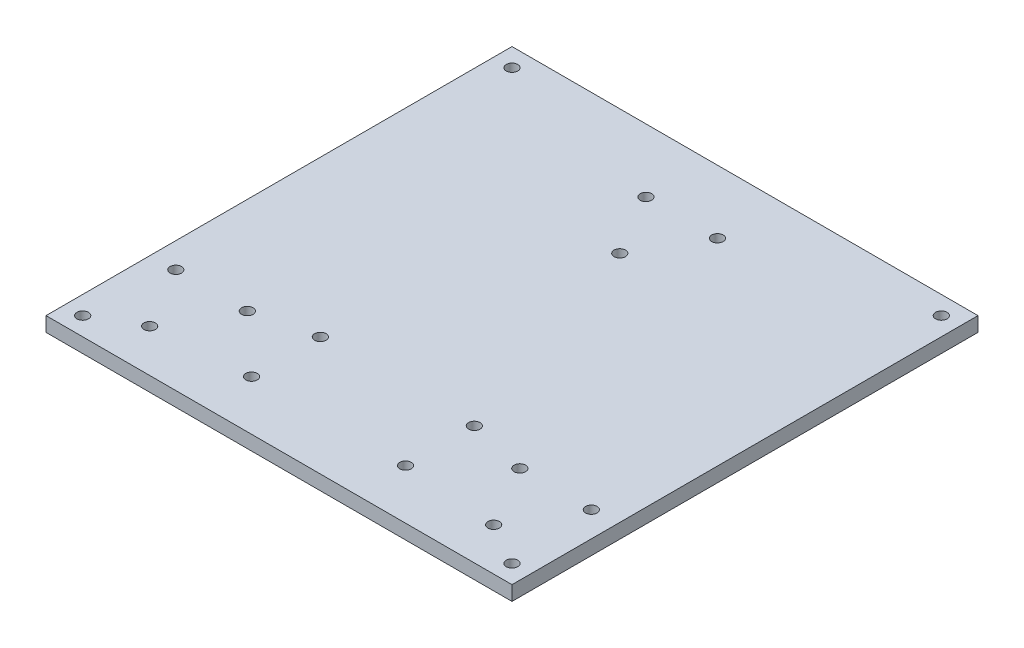
ISO-10303-21;
HEADER;
FILE_DESCRIPTION(('STEP AP214'),'2;1');
FILE_NAME('part.step','',(''),(''),'','','');
FILE_SCHEMA(('AUTOMOTIVE_DESIGN { 1 0 10303 214 1 1 1 1 }'));
ENDSEC;
DATA;
#1=APPLICATION_CONTEXT('core data for automotive mechanical design processes');
#2=APPLICATION_PROTOCOL_DEFINITION('international standard','automotive_design',2000,#1);
#3=PRODUCT_CONTEXT('',#1,'mechanical');
#4=PRODUCT('Part','Part','',(#3));
#5=PRODUCT_RELATED_PRODUCT_CATEGORY('part','',(#4));
#6=PRODUCT_DEFINITION_FORMATION('','',#4);
#7=PRODUCT_DEFINITION_CONTEXT('part definition',#1,'design');
#8=PRODUCT_DEFINITION('design','',#6,#7);
#9=PRODUCT_DEFINITION_SHAPE('','',#8);
#10=(LENGTH_UNIT() NAMED_UNIT(*) SI_UNIT(.MILLI.,.METRE.));
#11=(NAMED_UNIT(*) PLANE_ANGLE_UNIT() SI_UNIT($,.RADIAN.));
#12=(NAMED_UNIT(*) SI_UNIT($,.STERADIAN.) SOLID_ANGLE_UNIT());
#13=UNCERTAINTY_MEASURE_WITH_UNIT(LENGTH_MEASURE(1.E-05),#10,'distance_accuracy_value','');
#14=(GEOMETRIC_REPRESENTATION_CONTEXT(3) GLOBAL_UNCERTAINTY_ASSIGNED_CONTEXT((#13)) GLOBAL_UNIT_ASSIGNED_CONTEXT((#10,
#11,#12)) REPRESENTATION_CONTEXT('',''));
#15=CARTESIAN_POINT('',(0.,0.,0.));
#16=DIRECTION('',(0.,0.,1.));
#17=DIRECTION('',(1.,0.,0.));
#18=AXIS2_PLACEMENT_3D('',#15,#16,#17);
#19=CARTESIAN_POINT('',(101.6,6.35,101.6));
#20=DIRECTION('',(-1.,0.,0.));
#21=DIRECTION('',(0.,0.,1.));
#22=AXIS2_PLACEMENT_3D('',#19,#20,#21);
#23=PLANE('',#22);
#24=DIRECTION('',(0.,0.,-1.));
#25=VECTOR('',#24,1.);
#26=CARTESIAN_POINT('',(101.6,0.,101.6));
#27=LINE('',#26,#25);
#28=CARTESIAN_POINT('',(101.6,0.,101.6));
#29=VERTEX_POINT('',#28);
#30=CARTESIAN_POINT('',(101.6,0.,-101.6));
#31=VERTEX_POINT('',#30);
#32=EDGE_CURVE('E102',#29,#31,#27,.T.);
#33=ORIENTED_EDGE('',*,*,#32,.T.);
#34=DIRECTION('',(0.,-1.,0.));
#35=VECTOR('',#34,1.);
#36=CARTESIAN_POINT('',(101.6,6.35,-101.6));
#37=LINE('',#36,#35);
#38=CARTESIAN_POINT('',(101.6,6.35,-101.6));
#39=VERTEX_POINT('',#38);
#40=EDGE_CURVE('E11',#39,#31,#37,.T.);
#41=ORIENTED_EDGE('',*,*,#40,.F.);
#42=DIRECTION('',(0.,0.,-1.));
#43=VECTOR('',#42,1.);
#44=CARTESIAN_POINT('',(101.6,6.35,101.6));
#45=LINE('',#44,#43);
#46=CARTESIAN_POINT('',(101.6,6.35,101.6));
#47=VERTEX_POINT('',#46);
#48=EDGE_CURVE('E90',#47,#39,#45,.T.);
#49=ORIENTED_EDGE('',*,*,#48,.F.);
#50=DIRECTION('',(0.,-1.,0.));
#51=VECTOR('',#50,1.);
#52=CARTESIAN_POINT('',(101.6,6.35,101.6));
#53=LINE('',#52,#51);
#54=EDGE_CURVE('E98',#47,#29,#53,.T.);
#55=ORIENTED_EDGE('',*,*,#54,.T.);
#56=EDGE_LOOP('',(#33,#41,#49,#55));
#57=FACE_BOUND('',#56,.T.);
#58=ADVANCED_FACE('F39',(#57),#23,.F.);
#59=CARTESIAN_POINT('',(-101.6,6.35,-101.6));
#60=DIRECTION('',(0.,0.,1.));
#61=DIRECTION('',(1.,0.,0.));
#62=AXIS2_PLACEMENT_3D('',#59,#60,#61);
#63=PLANE('',#62);
#64=DIRECTION('',(-1.,0.,0.));
#65=VECTOR('',#64,1.);
#66=CARTESIAN_POINT('',(-101.6,0.,-101.6));
#67=LINE('',#66,#65);
#68=CARTESIAN_POINT('',(-101.6,0.,-101.6));
#69=VERTEX_POINT('',#68);
#70=EDGE_CURVE('E94',#31,#69,#67,.T.);
#71=ORIENTED_EDGE('',*,*,#70,.T.);
#72=DIRECTION('',(0.,-1.,0.));
#73=VECTOR('',#72,1.);
#74=CARTESIAN_POINT('',(-101.6,6.35,-101.6));
#75=LINE('',#74,#73);
#76=CARTESIAN_POINT('',(-101.6,6.35,-101.6));
#77=VERTEX_POINT('',#76);
#78=EDGE_CURVE('E47',#77,#69,#75,.T.);
#79=ORIENTED_EDGE('',*,*,#78,.F.);
#80=DIRECTION('',(-1.,0.,0.));
#81=VECTOR('',#80,1.);
#82=CARTESIAN_POINT('',(-101.6,6.35,-101.6));
#83=LINE('',#82,#81);
#84=EDGE_CURVE('E85',#39,#77,#83,.T.);
#85=ORIENTED_EDGE('',*,*,#84,.F.);
#86=ORIENTED_EDGE('',*,*,#40,.T.);
#87=EDGE_LOOP('',(#71,#79,#85,#86));
#88=FACE_BOUND('',#87,.T.);
#89=ADVANCED_FACE('F93',(#88),#63,.F.);
#90=CARTESIAN_POINT('',(-101.6,6.35,101.6));
#91=DIRECTION('',(1.,0.,0.));
#92=DIRECTION('',(0.,0.,-1.));
#93=AXIS2_PLACEMENT_3D('',#90,#91,#92);
#94=PLANE('',#93);
#95=DIRECTION('',(0.,0.,1.));
#96=VECTOR('',#95,1.);
#97=CARTESIAN_POINT('',(-101.6,0.,101.6));
#98=LINE('',#97,#96);
#99=CARTESIAN_POINT('',(-101.6,0.,101.6));
#100=VERTEX_POINT('',#99);
#101=EDGE_CURVE('E72',#69,#100,#98,.T.);
#102=ORIENTED_EDGE('',*,*,#101,.T.);
#103=DIRECTION('',(0.,-1.,0.));
#104=VECTOR('',#103,1.);
#105=CARTESIAN_POINT('',(-101.6,6.35,101.6));
#106=LINE('',#105,#104);
#107=CARTESIAN_POINT('',(-101.6,6.35,101.6));
#108=VERTEX_POINT('',#107);
#109=EDGE_CURVE('E95',#108,#100,#106,.T.);
#110=ORIENTED_EDGE('',*,*,#109,.F.);
#111=DIRECTION('',(0.,0.,1.));
#112=VECTOR('',#111,1.);
#113=CARTESIAN_POINT('',(-101.6,6.35,101.6));
#114=LINE('',#113,#112);
#115=EDGE_CURVE('E88',#77,#108,#114,.T.);
#116=ORIENTED_EDGE('',*,*,#115,.F.);
#117=ORIENTED_EDGE('',*,*,#78,.T.);
#118=EDGE_LOOP('',(#102,#110,#116,#117));
#119=FACE_BOUND('',#118,.T.);
#120=ADVANCED_FACE('F96',(#119),#94,.F.);
#121=CARTESIAN_POINT('',(-101.6,6.35,101.6));
#122=DIRECTION('',(0.,0.,-1.));
#123=DIRECTION('',(-1.,0.,0.));
#124=AXIS2_PLACEMENT_3D('',#121,#122,#123);
#125=PLANE('',#124);
#126=DIRECTION('',(1.,0.,0.));
#127=VECTOR('',#126,1.);
#128=CARTESIAN_POINT('',(-101.6,0.,101.6));
#129=LINE('',#128,#127);
#130=EDGE_CURVE('E78',#100,#29,#129,.T.);
#131=ORIENTED_EDGE('',*,*,#130,.T.);
#132=ORIENTED_EDGE('',*,*,#54,.F.);
#133=DIRECTION('',(1.,0.,0.));
#134=VECTOR('',#133,1.);
#135=CARTESIAN_POINT('',(-101.6,6.35,101.6));
#136=LINE('',#135,#134);
#137=EDGE_CURVE('E55',#108,#47,#136,.T.);
#138=ORIENTED_EDGE('',*,*,#137,.F.);
#139=ORIENTED_EDGE('',*,*,#109,.T.);
#140=EDGE_LOOP('',(#131,#132,#138,#139));
#141=FACE_BOUND('',#140,.T.);
#142=ADVANCED_FACE('F110',(#141),#125,.F.);
#143=CARTESIAN_POINT('',(0.,6.35,0.));
#144=DIRECTION('',(0.,-1.,0.));
#145=DIRECTION('',(0.,0.,-1.));
#146=AXIS2_PLACEMENT_3D('',#143,#144,#145);
#147=PLANE('',#146);
#148=CARTESIAN_POINT('',(15.58845726812,6.35,-74.0000000000001));
#149=DIRECTION('',(0.,1.,0.));
#150=DIRECTION('',(0.,0.,1.));
#151=AXIS2_PLACEMENT_3D('',#148,#149,#150);
#152=CIRCLE('',#151,2.5);
#153=CARTESIAN_POINT('',(15.58845726812,6.35,-71.5000000000001));
#154=VERTEX_POINT('',#153);
#155=EDGE_CURVE('E189',#154,#154,#152,.T.);
#156=ORIENTED_EDGE('',*,*,#155,.F.);
#157=EDGE_LOOP('',(#156));
#158=FACE_BOUND('',#157,.T.);
#159=CARTESIAN_POINT('',(1.40838729567605E-13,6.35,-47.0000000000001));
#160=DIRECTION('',(0.,1.,0.));
#161=DIRECTION('',(0.,0.,1.));
#162=AXIS2_PLACEMENT_3D('',#159,#160,#161);
#163=CIRCLE('',#162,2.5);
#164=CARTESIAN_POINT('',(1.40838729567605E-13,6.35,-44.5000000000001));
#165=VERTEX_POINT('',#164);
#166=EDGE_CURVE('E183',#165,#165,#163,.T.);
#167=ORIENTED_EDGE('',*,*,#166,.F.);
#168=EDGE_LOOP('',(#167));
#169=FACE_BOUND('',#168,.T.);
#170=CARTESIAN_POINT('',(-74.9999999999999,6.35,82.9999999999998));
#171=DIRECTION('',(0.,1.,0.));
#172=DIRECTION('',(0.,0.,1.));
#173=AXIS2_PLACEMENT_3D('',#170,#171,#172);
#174=CIRCLE('',#173,2.5);
#175=CARTESIAN_POINT('',(-74.9999999999999,6.35,85.4999999999998));
#176=VERTEX_POINT('',#175);
#177=EDGE_CURVE('E177',#176,#176,#174,.T.);
#178=ORIENTED_EDGE('',*,*,#177,.F.);
#179=EDGE_LOOP('',(#178));
#180=FACE_BOUND('',#179,.T.);
#181=CARTESIAN_POINT('',(-90.5884572681198,6.35,55.9999999999998));
#182=DIRECTION('',(0.,1.,0.));
#183=DIRECTION('',(0.,0.,1.));
#184=AXIS2_PLACEMENT_3D('',#181,#182,#183);
#185=CIRCLE('',#184,2.50000000000001);
#186=CARTESIAN_POINT('',(-90.5884572681198,6.35,58.4999999999999));
#187=VERTEX_POINT('',#186);
#188=EDGE_CURVE('E170',#187,#187,#185,.T.);
#189=ORIENTED_EDGE('',*,*,#188,.F.);
#190=EDGE_LOOP('',(#189));
#191=FACE_BOUND('',#190,.T.);
#192=CARTESIAN_POINT('',(-59.41154273188,6.35,55.9999999999998));
#193=DIRECTION('',(0.,1.,0.));
#194=DIRECTION('',(0.,0.,1.));
#195=AXIS2_PLACEMENT_3D('',#192,#193,#194);
#196=CIRCLE('',#195,2.5);
#197=CARTESIAN_POINT('',(-59.41154273188,6.35,58.4999999999998));
#198=VERTEX_POINT('',#197);
#199=EDGE_CURVE('E212',#198,#198,#196,.T.);
#200=ORIENTED_EDGE('',*,*,#199,.F.);
#201=EDGE_LOOP('',(#200));
#202=FACE_BOUND('',#201,.T.);
#203=CARTESIAN_POINT('',(59.4115427318802,6.35,55.9999999999998));
#204=DIRECTION('',(0.,1.,0.));
#205=DIRECTION('',(0.,0.,1.));
#206=AXIS2_PLACEMENT_3D('',#203,#204,#205);
#207=CIRCLE('',#206,2.50000000000002);
#208=CARTESIAN_POINT('',(59.4115427318802,6.35,58.4999999999998));
#209=VERTEX_POINT('',#208);
#210=EDGE_CURVE('E206',#209,#209,#207,.T.);
#211=ORIENTED_EDGE('',*,*,#210,.F.);
#212=EDGE_LOOP('',(#211));
#213=FACE_BOUND('',#212,.T.);
#214=CARTESIAN_POINT('',(90.58845726812,6.35,55.9999999999998));
#215=DIRECTION('',(0.,1.,0.));
#216=DIRECTION('',(0.,0.,1.));
#217=AXIS2_PLACEMENT_3D('',#214,#215,#216);
#218=CIRCLE('',#217,2.50000000000001);
#219=CARTESIAN_POINT('',(90.58845726812,6.35,58.4999999999998));
#220=VERTEX_POINT('',#219);
#221=EDGE_CURVE('E200',#220,#220,#218,.T.);
#222=ORIENTED_EDGE('',*,*,#221,.F.);
#223=EDGE_LOOP('',(#222));
#224=FACE_BOUND('',#223,.T.);
#225=CARTESIAN_POINT('',(75.0000000000001,6.35,82.9999999999998));
#226=DIRECTION('',(0.,1.,0.));
#227=DIRECTION('',(0.,0.,1.));
#228=AXIS2_PLACEMENT_3D('',#225,#226,#227);
#229=CIRCLE('',#228,2.5);
#230=CARTESIAN_POINT('',(75.0000000000001,6.35,85.4999999999998));
#231=VERTEX_POINT('',#230);
#232=EDGE_CURVE('E194',#231,#231,#229,.T.);
#233=ORIENTED_EDGE('',*,*,#232,.F.);
#234=EDGE_LOOP('',(#233));
#235=FACE_BOUND('',#234,.T.);
#236=CARTESIAN_POINT('',(-15.5884572681198,6.35,-74.0000000000001));
#237=DIRECTION('',(0.,1.,0.));
#238=DIRECTION('',(0.,0.,1.));
#239=AXIS2_PLACEMENT_3D('',#236,#237,#238);
#240=CIRCLE('',#239,2.50000000000001);
#241=CARTESIAN_POINT('',(-15.5884572681198,6.35,-71.5000000000001));
#242=VERTEX_POINT('',#241);
#243=EDGE_CURVE('E164',#242,#242,#240,.T.);
#244=ORIENTED_EDGE('',*,*,#243,.F.);
#245=EDGE_LOOP('',(#244));
#246=FACE_BOUND('',#245,.T.);
#247=CARTESIAN_POINT('',(-93.6,6.35,93.6));
#248=DIRECTION('',(0.,1.,0.));
#249=DIRECTION('',(0.,0.,1.));
#250=AXIS2_PLACEMENT_3D('',#247,#248,#249);
#251=CIRCLE('',#250,2.5);
#252=CARTESIAN_POINT('',(-93.6,6.35,96.1));
#253=VERTEX_POINT('',#252);
#254=EDGE_CURVE('E146',#253,#253,#251,.T.);
#255=ORIENTED_EDGE('',*,*,#254,.F.);
#256=EDGE_LOOP('',(#255));
#257=FACE_BOUND('',#256,.T.);
#258=CARTESIAN_POINT('',(93.6,6.35,93.6));
#259=DIRECTION('',(0.,1.,0.));
#260=DIRECTION('',(0.,0.,1.));
#261=AXIS2_PLACEMENT_3D('',#258,#259,#260);
#262=CIRCLE('',#261,2.5);
#263=CARTESIAN_POINT('',(93.6,6.35,96.1));
#264=VERTEX_POINT('',#263);
#265=EDGE_CURVE('E153',#264,#264,#262,.T.);
#266=ORIENTED_EDGE('',*,*,#265,.F.);
#267=EDGE_LOOP('',(#266));
#268=FACE_BOUND('',#267,.T.);
#269=CARTESIAN_POINT('',(93.6,6.35,-93.6));
#270=DIRECTION('',(0.,1.,0.));
#271=DIRECTION('',(0.,0.,1.));
#272=AXIS2_PLACEMENT_3D('',#269,#270,#271);
#273=CIRCLE('',#272,2.5);
#274=CARTESIAN_POINT('',(93.6,6.35,-91.1));
#275=VERTEX_POINT('',#274);
#276=EDGE_CURVE('E159',#275,#275,#273,.T.);
#277=ORIENTED_EDGE('',*,*,#276,.F.);
#278=EDGE_LOOP('',(#277));
#279=FACE_BOUND('',#278,.T.);
#280=CARTESIAN_POINT('',(-93.6,6.35,-93.6));
#281=DIRECTION('',(0.,1.,0.));
#282=DIRECTION('',(0.,0.,1.));
#283=AXIS2_PLACEMENT_3D('',#280,#281,#282);
#284=CIRCLE('',#283,2.5);
#285=CARTESIAN_POINT('',(-93.6,6.35,-91.1));
#286=VERTEX_POINT('',#285);
#287=EDGE_CURVE('E140',#286,#286,#284,.T.);
#288=ORIENTED_EDGE('',*,*,#287,.F.);
#289=EDGE_LOOP('',(#288));
#290=FACE_BOUND('',#289,.T.);
#291=CARTESIAN_POINT('',(33.4250000000001,6.35,49.8500000000001));
#292=DIRECTION('',(0.,1.,0.));
#293=DIRECTION('',(0.,0.,1.));
#294=AXIS2_PLACEMENT_3D('',#291,#292,#293);
#295=CIRCLE('',#294,2.5);
#296=CARTESIAN_POINT('',(33.4250000000001,6.35,52.3500000000001));
#297=VERTEX_POINT('',#296);
#298=EDGE_CURVE('E122',#297,#297,#295,.T.);
#299=ORIENTED_EDGE('',*,*,#298,.F.);
#300=EDGE_LOOP('',(#299));
#301=FACE_BOUND('',#300,.T.);
#302=CARTESIAN_POINT('',(33.4250000000001,6.35,79.8500000000001));
#303=DIRECTION('',(0.,1.,0.));
#304=DIRECTION('',(0.,0.,1.));
#305=AXIS2_PLACEMENT_3D('',#302,#303,#304);
#306=CIRCLE('',#305,2.5);
#307=CARTESIAN_POINT('',(33.4250000000001,6.35,82.3500000000001));
#308=VERTEX_POINT('',#307);
#309=EDGE_CURVE('E129',#308,#308,#306,.T.);
#310=ORIENTED_EDGE('',*,*,#309,.F.);
#311=EDGE_LOOP('',(#310));
#312=FACE_BOUND('',#311,.T.);
#313=CARTESIAN_POINT('',(-33.7249999999999,6.35,79.8500000000001));
#314=DIRECTION('',(0.,1.,0.));
#315=DIRECTION('',(0.,0.,1.));
#316=AXIS2_PLACEMENT_3D('',#313,#314,#315);
#317=CIRCLE('',#316,2.5);
#318=CARTESIAN_POINT('',(-33.7249999999999,6.35,82.3500000000001));
#319=VERTEX_POINT('',#318);
#320=EDGE_CURVE('E135',#319,#319,#317,.T.);
#321=ORIENTED_EDGE('',*,*,#320,.F.);
#322=EDGE_LOOP('',(#321));
#323=FACE_BOUND('',#322,.T.);
#324=CARTESIAN_POINT('',(-33.7249999999999,6.35,49.8500000000001));
#325=DIRECTION('',(0.,1.,0.));
#326=DIRECTION('',(0.,0.,1.));
#327=AXIS2_PLACEMENT_3D('',#324,#325,#326);
#328=CIRCLE('',#327,2.5);
#329=CARTESIAN_POINT('',(-33.7249999999999,6.35,52.3500000000001));
#330=VERTEX_POINT('',#329);
#331=EDGE_CURVE('E116',#330,#330,#328,.T.);
#332=ORIENTED_EDGE('',*,*,#331,.F.);
#333=EDGE_LOOP('',(#332));
#334=FACE_BOUND('',#333,.T.);
#335=ORIENTED_EDGE('',*,*,#48,.T.);
#336=ORIENTED_EDGE('',*,*,#84,.T.);
#337=ORIENTED_EDGE('',*,*,#115,.T.);
#338=ORIENTED_EDGE('',*,*,#137,.T.);
#339=EDGE_LOOP('',(#335,#336,#337,#338));
#340=FACE_BOUND('',#339,.T.);
#341=ADVANCED_FACE('F86',(#158,#169,#180,#191,#202,#213,#224,#235,#246,#257,#268,#279,#290,#301,
#312,#323,#334,#340),#147,.F.);
#342=CARTESIAN_POINT('',(0.,0.,0.));
#343=DIRECTION('',(0.,-1.,0.));
#344=DIRECTION('',(0.,0.,-1.));
#345=AXIS2_PLACEMENT_3D('',#342,#343,#344);
#346=PLANE('',#345);
#347=CARTESIAN_POINT('',(15.58845726812,0.,-74.0000000000001));
#348=DIRECTION('',(0.,1.,0.));
#349=DIRECTION('',(0.,0.,1.));
#350=AXIS2_PLACEMENT_3D('',#347,#348,#349);
#351=CIRCLE('',#350,2.5);
#352=CARTESIAN_POINT('',(15.58845726812,0.,-71.5000000000001));
#353=VERTEX_POINT('',#352);
#354=EDGE_CURVE('E167',#353,#353,#351,.T.);
#355=ORIENTED_EDGE('',*,*,#354,.T.);
#356=EDGE_LOOP('',(#355));
#357=FACE_BOUND('',#356,.T.);
#358=CARTESIAN_POINT('',(1.40838729567605E-13,0.,-47.0000000000001));
#359=DIRECTION('',(0.,1.,0.));
#360=DIRECTION('',(0.,0.,1.));
#361=AXIS2_PLACEMENT_3D('',#358,#359,#360);
#362=CIRCLE('',#361,2.5);
#363=CARTESIAN_POINT('',(1.40838729567605E-13,0.,-44.5000000000001));
#364=VERTEX_POINT('',#363);
#365=EDGE_CURVE('E186',#364,#364,#362,.T.);
#366=ORIENTED_EDGE('',*,*,#365,.T.);
#367=EDGE_LOOP('',(#366));
#368=FACE_BOUND('',#367,.T.);
#369=CARTESIAN_POINT('',(-74.9999999999999,0.,82.9999999999998));
#370=DIRECTION('',(0.,1.,0.));
#371=DIRECTION('',(0.,0.,1.));
#372=AXIS2_PLACEMENT_3D('',#369,#370,#371);
#373=CIRCLE('',#372,2.5);
#374=CARTESIAN_POINT('',(-74.9999999999999,0.,85.4999999999998));
#375=VERTEX_POINT('',#374);
#376=EDGE_CURVE('E180',#375,#375,#373,.T.);
#377=ORIENTED_EDGE('',*,*,#376,.T.);
#378=EDGE_LOOP('',(#377));
#379=FACE_BOUND('',#378,.T.);
#380=CARTESIAN_POINT('',(-90.5884572681198,0.,55.9999999999998));
#381=DIRECTION('',(0.,1.,0.));
#382=DIRECTION('',(0.,0.,1.));
#383=AXIS2_PLACEMENT_3D('',#380,#381,#382);
#384=CIRCLE('',#383,2.50000000000001);
#385=CARTESIAN_POINT('',(-90.5884572681198,0.,58.4999999999999));
#386=VERTEX_POINT('',#385);
#387=EDGE_CURVE('E173',#386,#386,#384,.T.);
#388=ORIENTED_EDGE('',*,*,#387,.T.);
#389=EDGE_LOOP('',(#388));
#390=FACE_BOUND('',#389,.T.);
#391=CARTESIAN_POINT('',(-59.41154273188,0.,55.9999999999998));
#392=DIRECTION('',(0.,1.,0.));
#393=DIRECTION('',(0.,0.,1.));
#394=AXIS2_PLACEMENT_3D('',#391,#392,#393);
#395=CIRCLE('',#394,2.5);
#396=CARTESIAN_POINT('',(-59.41154273188,0.,58.4999999999998));
#397=VERTEX_POINT('',#396);
#398=EDGE_CURVE('E174',#397,#397,#395,.T.);
#399=ORIENTED_EDGE('',*,*,#398,.T.);
#400=EDGE_LOOP('',(#399));
#401=FACE_BOUND('',#400,.T.);
#402=CARTESIAN_POINT('',(59.4115427318802,0.,55.9999999999998));
#403=DIRECTION('',(0.,1.,0.));
#404=DIRECTION('',(0.,0.,1.));
#405=AXIS2_PLACEMENT_3D('',#402,#403,#404);
#406=CIRCLE('',#405,2.50000000000002);
#407=CARTESIAN_POINT('',(59.4115427318802,0.,58.4999999999998));
#408=VERTEX_POINT('',#407);
#409=EDGE_CURVE('E209',#408,#408,#406,.T.);
#410=ORIENTED_EDGE('',*,*,#409,.T.);
#411=EDGE_LOOP('',(#410));
#412=FACE_BOUND('',#411,.T.);
#413=CARTESIAN_POINT('',(90.58845726812,0.,55.9999999999998));
#414=DIRECTION('',(0.,1.,0.));
#415=DIRECTION('',(0.,0.,1.));
#416=AXIS2_PLACEMENT_3D('',#413,#414,#415);
#417=CIRCLE('',#416,2.50000000000001);
#418=CARTESIAN_POINT('',(90.58845726812,0.,58.4999999999998));
#419=VERTEX_POINT('',#418);
#420=EDGE_CURVE('E203',#419,#419,#417,.T.);
#421=ORIENTED_EDGE('',*,*,#420,.T.);
#422=EDGE_LOOP('',(#421));
#423=FACE_BOUND('',#422,.T.);
#424=CARTESIAN_POINT('',(75.0000000000001,0.,82.9999999999998));
#425=DIRECTION('',(0.,1.,0.));
#426=DIRECTION('',(0.,0.,1.));
#427=AXIS2_PLACEMENT_3D('',#424,#425,#426);
#428=CIRCLE('',#427,2.5);
#429=CARTESIAN_POINT('',(75.0000000000001,0.,85.4999999999998));
#430=VERTEX_POINT('',#429);
#431=EDGE_CURVE('E197',#430,#430,#428,.T.);
#432=ORIENTED_EDGE('',*,*,#431,.T.);
#433=EDGE_LOOP('',(#432));
#434=FACE_BOUND('',#433,.T.);
#435=CARTESIAN_POINT('',(-15.5884572681198,0.,-74.0000000000001));
#436=DIRECTION('',(0.,1.,0.));
#437=DIRECTION('',(0.,0.,1.));
#438=AXIS2_PLACEMENT_3D('',#435,#436,#437);
#439=CIRCLE('',#438,2.50000000000001);
#440=CARTESIAN_POINT('',(-15.5884572681198,0.,-71.5000000000001));
#441=VERTEX_POINT('',#440);
#442=EDGE_CURVE('E150',#441,#441,#439,.T.);
#443=ORIENTED_EDGE('',*,*,#442,.T.);
#444=EDGE_LOOP('',(#443));
#445=FACE_BOUND('',#444,.T.);
#446=CARTESIAN_POINT('',(-93.6,0.,93.6));
#447=DIRECTION('',(0.,1.,0.));
#448=DIRECTION('',(0.,0.,1.));
#449=AXIS2_PLACEMENT_3D('',#446,#447,#448);
#450=CIRCLE('',#449,2.5);
#451=CARTESIAN_POINT('',(-93.6,0.,96.1));
#452=VERTEX_POINT('',#451);
#453=EDGE_CURVE('E149',#452,#452,#450,.T.);
#454=ORIENTED_EDGE('',*,*,#453,.T.);
#455=EDGE_LOOP('',(#454));
#456=FACE_BOUND('',#455,.T.);
#457=CARTESIAN_POINT('',(93.6,0.,93.6));
#458=DIRECTION('',(0.,1.,0.));
#459=DIRECTION('',(0.,0.,1.));
#460=AXIS2_PLACEMENT_3D('',#457,#458,#459);
#461=CIRCLE('',#460,2.5);
#462=CARTESIAN_POINT('',(93.6,0.,96.1));
#463=VERTEX_POINT('',#462);
#464=EDGE_CURVE('E156',#463,#463,#461,.T.);
#465=ORIENTED_EDGE('',*,*,#464,.T.);
#466=EDGE_LOOP('',(#465));
#467=FACE_BOUND('',#466,.T.);
#468=CARTESIAN_POINT('',(93.6,0.,-93.6));
#469=DIRECTION('',(0.,1.,0.));
#470=DIRECTION('',(0.,0.,1.));
#471=AXIS2_PLACEMENT_3D('',#468,#469,#470);
#472=CIRCLE('',#471,2.5);
#473=CARTESIAN_POINT('',(93.6,0.,-91.1));
#474=VERTEX_POINT('',#473);
#475=EDGE_CURVE('E143',#474,#474,#472,.T.);
#476=ORIENTED_EDGE('',*,*,#475,.T.);
#477=EDGE_LOOP('',(#476));
#478=FACE_BOUND('',#477,.T.);
#479=CARTESIAN_POINT('',(-93.6,0.,-93.6));
#480=DIRECTION('',(0.,1.,0.));
#481=DIRECTION('',(0.,0.,1.));
#482=AXIS2_PLACEMENT_3D('',#479,#480,#481);
#483=CIRCLE('',#482,2.5);
#484=CARTESIAN_POINT('',(-93.6,0.,-91.1));
#485=VERTEX_POINT('',#484);
#486=EDGE_CURVE('E126',#485,#485,#483,.T.);
#487=ORIENTED_EDGE('',*,*,#486,.T.);
#488=EDGE_LOOP('',(#487));
#489=FACE_BOUND('',#488,.T.);
#490=CARTESIAN_POINT('',(33.4250000000001,0.,49.8500000000001));
#491=DIRECTION('',(0.,1.,0.));
#492=DIRECTION('',(0.,0.,1.));
#493=AXIS2_PLACEMENT_3D('',#490,#491,#492);
#494=CIRCLE('',#493,2.5);
#495=CARTESIAN_POINT('',(33.4250000000001,0.,52.3500000000001));
#496=VERTEX_POINT('',#495);
#497=EDGE_CURVE('E125',#496,#496,#494,.T.);
#498=ORIENTED_EDGE('',*,*,#497,.T.);
#499=EDGE_LOOP('',(#498));
#500=FACE_BOUND('',#499,.T.);
#501=CARTESIAN_POINT('',(33.4250000000001,0.,79.8500000000001));
#502=DIRECTION('',(0.,1.,0.));
#503=DIRECTION('',(0.,0.,1.));
#504=AXIS2_PLACEMENT_3D('',#501,#502,#503);
#505=CIRCLE('',#504,2.5);
#506=CARTESIAN_POINT('',(33.4250000000001,0.,82.3500000000001));
#507=VERTEX_POINT('',#506);
#508=EDGE_CURVE('E132',#507,#507,#505,.T.);
#509=ORIENTED_EDGE('',*,*,#508,.T.);
#510=EDGE_LOOP('',(#509));
#511=FACE_BOUND('',#510,.T.);
#512=CARTESIAN_POINT('',(-33.7249999999999,0.,79.8500000000001));
#513=DIRECTION('',(0.,1.,0.));
#514=DIRECTION('',(0.,0.,1.));
#515=AXIS2_PLACEMENT_3D('',#512,#513,#514);
#516=CIRCLE('',#515,2.5);
#517=CARTESIAN_POINT('',(-33.7249999999999,0.,82.3500000000001));
#518=VERTEX_POINT('',#517);
#519=EDGE_CURVE('E119',#518,#518,#516,.T.);
#520=ORIENTED_EDGE('',*,*,#519,.T.);
#521=EDGE_LOOP('',(#520));
#522=FACE_BOUND('',#521,.T.);
#523=CARTESIAN_POINT('',(-33.7249999999999,0.,49.8500000000001));
#524=DIRECTION('',(0.,1.,0.));
#525=DIRECTION('',(0.,0.,1.));
#526=AXIS2_PLACEMENT_3D('',#523,#524,#525);
#527=CIRCLE('',#526,2.5);
#528=CARTESIAN_POINT('',(-33.7249999999999,0.,52.3500000000001));
#529=VERTEX_POINT('',#528);
#530=EDGE_CURVE('E105',#529,#529,#527,.T.);
#531=ORIENTED_EDGE('',*,*,#530,.T.);
#532=EDGE_LOOP('',(#531));
#533=FACE_BOUND('',#532,.T.);
#534=ORIENTED_EDGE('',*,*,#32,.F.);
#535=ORIENTED_EDGE('',*,*,#130,.F.);
#536=ORIENTED_EDGE('',*,*,#101,.F.);
#537=ORIENTED_EDGE('',*,*,#70,.F.);
#538=EDGE_LOOP('',(#534,#535,#536,#537));
#539=FACE_BOUND('',#538,.T.);
#540=ADVANCED_FACE('F113',(#357,#368,#379,#390,#401,#412,#423,#434,#445,#456,#467,#478,#489,
#500,#511,#522,#533,#539),#346,.T.);
#541=CARTESIAN_POINT('',(-33.7249999999999,0.,49.8500000000001));
#542=DIRECTION('',(0.,1.,0.));
#543=DIRECTION('',(0.,0.,1.));
#544=AXIS2_PLACEMENT_3D('',#541,#542,#543);
#545=CYLINDRICAL_SURFACE('',#544,2.5);
#546=ORIENTED_EDGE('',*,*,#530,.F.);
#547=EDGE_LOOP('',(#546));
#548=FACE_BOUND('',#547,.T.);
#549=ORIENTED_EDGE('',*,*,#331,.T.);
#550=EDGE_LOOP('',(#549));
#551=FACE_BOUND('',#550,.T.);
#552=ADVANCED_FACE('F256',(#548,#551),#545,.F.);
#553=CARTESIAN_POINT('',(-33.7249999999999,0.,79.8500000000001));
#554=DIRECTION('',(0.,1.,0.));
#555=DIRECTION('',(0.,0.,1.));
#556=AXIS2_PLACEMENT_3D('',#553,#554,#555);
#557=CYLINDRICAL_SURFACE('',#556,2.5);
#558=ORIENTED_EDGE('',*,*,#519,.F.);
#559=EDGE_LOOP('',(#558));
#560=FACE_BOUND('',#559,.T.);
#561=ORIENTED_EDGE('',*,*,#320,.T.);
#562=EDGE_LOOP('',(#561));
#563=FACE_BOUND('',#562,.T.);
#564=ADVANCED_FACE('F258',(#560,#563),#557,.F.);
#565=CARTESIAN_POINT('',(33.4250000000001,0.,79.8500000000001));
#566=DIRECTION('',(0.,1.,0.));
#567=DIRECTION('',(0.,0.,1.));
#568=AXIS2_PLACEMENT_3D('',#565,#566,#567);
#569=CYLINDRICAL_SURFACE('',#568,2.5);
#570=ORIENTED_EDGE('',*,*,#508,.F.);
#571=EDGE_LOOP('',(#570));
#572=FACE_BOUND('',#571,.T.);
#573=ORIENTED_EDGE('',*,*,#309,.T.);
#574=EDGE_LOOP('',(#573));
#575=FACE_BOUND('',#574,.T.);
#576=ADVANCED_FACE('F265',(#572,#575),#569,.F.);
#577=CARTESIAN_POINT('',(33.4250000000001,0.,49.8500000000001));
#578=DIRECTION('',(0.,1.,0.));
#579=DIRECTION('',(0.,0.,1.));
#580=AXIS2_PLACEMENT_3D('',#577,#578,#579);
#581=CYLINDRICAL_SURFACE('',#580,2.5);
#582=ORIENTED_EDGE('',*,*,#497,.F.);
#583=EDGE_LOOP('',(#582));
#584=FACE_BOUND('',#583,.T.);
#585=ORIENTED_EDGE('',*,*,#298,.T.);
#586=EDGE_LOOP('',(#585));
#587=FACE_BOUND('',#586,.T.);
#588=ADVANCED_FACE('F404',(#584,#587),#581,.F.);
#589=CARTESIAN_POINT('',(-93.6,0.,-93.6));
#590=DIRECTION('',(0.,1.,0.));
#591=DIRECTION('',(0.,0.,1.));
#592=AXIS2_PLACEMENT_3D('',#589,#590,#591);
#593=CYLINDRICAL_SURFACE('',#592,2.5);
#594=ORIENTED_EDGE('',*,*,#486,.F.);
#595=EDGE_LOOP('',(#594));
#596=FACE_BOUND('',#595,.T.);
#597=ORIENTED_EDGE('',*,*,#287,.T.);
#598=EDGE_LOOP('',(#597));
#599=FACE_BOUND('',#598,.T.);
#600=ADVANCED_FACE('F396',(#596,#599),#593,.F.);
#601=CARTESIAN_POINT('',(93.6,0.,-93.6));
#602=DIRECTION('',(0.,1.,0.));
#603=DIRECTION('',(0.,0.,1.));
#604=AXIS2_PLACEMENT_3D('',#601,#602,#603);
#605=CYLINDRICAL_SURFACE('',#604,2.5);
#606=ORIENTED_EDGE('',*,*,#475,.F.);
#607=EDGE_LOOP('',(#606));
#608=FACE_BOUND('',#607,.T.);
#609=ORIENTED_EDGE('',*,*,#276,.T.);
#610=EDGE_LOOP('',(#609));
#611=FACE_BOUND('',#610,.T.);
#612=ADVANCED_FACE('F392',(#608,#611),#605,.F.);
#613=CARTESIAN_POINT('',(93.6,0.,93.6));
#614=DIRECTION('',(0.,1.,0.));
#615=DIRECTION('',(0.,0.,1.));
#616=AXIS2_PLACEMENT_3D('',#613,#614,#615);
#617=CYLINDRICAL_SURFACE('',#616,2.5);
#618=ORIENTED_EDGE('',*,*,#464,.F.);
#619=EDGE_LOOP('',(#618));
#620=FACE_BOUND('',#619,.T.);
#621=ORIENTED_EDGE('',*,*,#265,.T.);
#622=EDGE_LOOP('',(#621));
#623=FACE_BOUND('',#622,.T.);
#624=ADVANCED_FACE('F395',(#620,#623),#617,.F.);
#625=CARTESIAN_POINT('',(-93.6,0.,93.6));
#626=DIRECTION('',(0.,1.,0.));
#627=DIRECTION('',(0.,0.,1.));
#628=AXIS2_PLACEMENT_3D('',#625,#626,#627);
#629=CYLINDRICAL_SURFACE('',#628,2.5);
#630=ORIENTED_EDGE('',*,*,#453,.F.);
#631=EDGE_LOOP('',(#630));
#632=FACE_BOUND('',#631,.T.);
#633=ORIENTED_EDGE('',*,*,#254,.T.);
#634=EDGE_LOOP('',(#633));
#635=FACE_BOUND('',#634,.T.);
#636=ADVANCED_FACE('F309',(#632,#635),#629,.F.);
#637=CARTESIAN_POINT('',(-15.5884572681198,0.,-74.0000000000001));
#638=DIRECTION('',(0.,1.,0.));
#639=DIRECTION('',(0.,0.,1.));
#640=AXIS2_PLACEMENT_3D('',#637,#638,#639);
#641=CYLINDRICAL_SURFACE('',#640,2.50000000000001);
#642=ORIENTED_EDGE('',*,*,#442,.F.);
#643=EDGE_LOOP('',(#642));
#644=FACE_BOUND('',#643,.T.);
#645=ORIENTED_EDGE('',*,*,#243,.T.);
#646=EDGE_LOOP('',(#645));
#647=FACE_BOUND('',#646,.T.);
#648=ADVANCED_FACE('F303',(#644,#647),#641,.F.);
#649=CARTESIAN_POINT('',(75.0000000000001,0.,82.9999999999998));
#650=DIRECTION('',(0.,1.,0.));
#651=DIRECTION('',(0.,0.,1.));
#652=AXIS2_PLACEMENT_3D('',#649,#650,#651);
#653=CYLINDRICAL_SURFACE('',#652,2.5);
#654=ORIENTED_EDGE('',*,*,#431,.F.);
#655=EDGE_LOOP('',(#654));
#656=FACE_BOUND('',#655,.T.);
#657=ORIENTED_EDGE('',*,*,#232,.T.);
#658=EDGE_LOOP('',(#657));
#659=FACE_BOUND('',#658,.T.);
#660=ADVANCED_FACE('F308',(#656,#659),#653,.F.);
#661=CARTESIAN_POINT('',(90.58845726812,0.,55.9999999999998));
#662=DIRECTION('',(0.,1.,0.));
#663=DIRECTION('',(0.,0.,1.));
#664=AXIS2_PLACEMENT_3D('',#661,#662,#663);
#665=CYLINDRICAL_SURFACE('',#664,2.50000000000001);
#666=ORIENTED_EDGE('',*,*,#420,.F.);
#667=EDGE_LOOP('',(#666));
#668=FACE_BOUND('',#667,.T.);
#669=ORIENTED_EDGE('',*,*,#221,.T.);
#670=EDGE_LOOP('',(#669));
#671=FACE_BOUND('',#670,.T.);
#672=ADVANCED_FACE('F321',(#668,#671),#665,.F.);
#673=CARTESIAN_POINT('',(59.4115427318802,0.,55.9999999999998));
#674=DIRECTION('',(0.,1.,0.));
#675=DIRECTION('',(0.,0.,1.));
#676=AXIS2_PLACEMENT_3D('',#673,#674,#675);
#677=CYLINDRICAL_SURFACE('',#676,2.50000000000002);
#678=ORIENTED_EDGE('',*,*,#409,.F.);
#679=EDGE_LOOP('',(#678));
#680=FACE_BOUND('',#679,.T.);
#681=ORIENTED_EDGE('',*,*,#210,.T.);
#682=EDGE_LOOP('',(#681));
#683=FACE_BOUND('',#682,.T.);
#684=ADVANCED_FACE('F224',(#680,#683),#677,.F.);
#685=CARTESIAN_POINT('',(-59.41154273188,0.,55.9999999999998));
#686=DIRECTION('',(0.,1.,0.));
#687=DIRECTION('',(0.,0.,1.));
#688=AXIS2_PLACEMENT_3D('',#685,#686,#687);
#689=CYLINDRICAL_SURFACE('',#688,2.5);
#690=ORIENTED_EDGE('',*,*,#398,.F.);
#691=EDGE_LOOP('',(#690));
#692=FACE_BOUND('',#691,.T.);
#693=ORIENTED_EDGE('',*,*,#199,.T.);
#694=EDGE_LOOP('',(#693));
#695=FACE_BOUND('',#694,.T.);
#696=ADVANCED_FACE('F220',(#692,#695),#689,.F.);
#697=CARTESIAN_POINT('',(-90.5884572681198,0.,55.9999999999998));
#698=DIRECTION('',(0.,1.,0.));
#699=DIRECTION('',(0.,0.,1.));
#700=AXIS2_PLACEMENT_3D('',#697,#698,#699);
#701=CYLINDRICAL_SURFACE('',#700,2.50000000000001);
#702=ORIENTED_EDGE('',*,*,#387,.F.);
#703=EDGE_LOOP('',(#702));
#704=FACE_BOUND('',#703,.T.);
#705=ORIENTED_EDGE('',*,*,#188,.T.);
#706=EDGE_LOOP('',(#705));
#707=FACE_BOUND('',#706,.T.);
#708=ADVANCED_FACE('F223',(#704,#707),#701,.F.);
#709=CARTESIAN_POINT('',(-74.9999999999999,0.,82.9999999999998));
#710=DIRECTION('',(0.,1.,0.));
#711=DIRECTION('',(0.,0.,1.));
#712=AXIS2_PLACEMENT_3D('',#709,#710,#711);
#713=CYLINDRICAL_SURFACE('',#712,2.5);
#714=ORIENTED_EDGE('',*,*,#376,.F.);
#715=EDGE_LOOP('',(#714));
#716=FACE_BOUND('',#715,.T.);
#717=ORIENTED_EDGE('',*,*,#177,.T.);
#718=EDGE_LOOP('',(#717));
#719=FACE_BOUND('',#718,.T.);
#720=ADVANCED_FACE('F355',(#716,#719),#713,.F.);
#721=CARTESIAN_POINT('',(1.40838729567605E-13,0.,-47.0000000000001));
#722=DIRECTION('',(0.,1.,0.));
#723=DIRECTION('',(0.,0.,1.));
#724=AXIS2_PLACEMENT_3D('',#721,#722,#723);
#725=CYLINDRICAL_SURFACE('',#724,2.5);
#726=ORIENTED_EDGE('',*,*,#365,.F.);
#727=EDGE_LOOP('',(#726));
#728=FACE_BOUND('',#727,.T.);
#729=ORIENTED_EDGE('',*,*,#166,.T.);
#730=EDGE_LOOP('',(#729));
#731=FACE_BOUND('',#730,.T.);
#732=ADVANCED_FACE('F365',(#728,#731),#725,.F.);
#733=CARTESIAN_POINT('',(15.58845726812,0.,-74.0000000000001));
#734=DIRECTION('',(0.,1.,0.));
#735=DIRECTION('',(0.,0.,1.));
#736=AXIS2_PLACEMENT_3D('',#733,#734,#735);
#737=CYLINDRICAL_SURFACE('',#736,2.5);
#738=ORIENTED_EDGE('',*,*,#354,.F.);
#739=EDGE_LOOP('',(#738));
#740=FACE_BOUND('',#739,.T.);
#741=ORIENTED_EDGE('',*,*,#155,.T.);
#742=EDGE_LOOP('',(#741));
#743=FACE_BOUND('',#742,.T.);
#744=ADVANCED_FACE('F375',(#740,#743),#737,.F.);
#745=CLOSED_SHELL('',(#58,#89,#120,#142,#341,#540,#552,#564,#576,#588,#600,#612,#624,#636,#648,
#660,#672,#684,#696,#708,#720,#732,#744));
#746=MANIFOLD_SOLID_BREP('B2',#745);
#747=ADVANCED_BREP_SHAPE_REPRESENTATION('',(#18,#746),#14);
#748=SHAPE_DEFINITION_REPRESENTATION(#9,#747);
ENDSEC;
END-ISO-10303-21;
